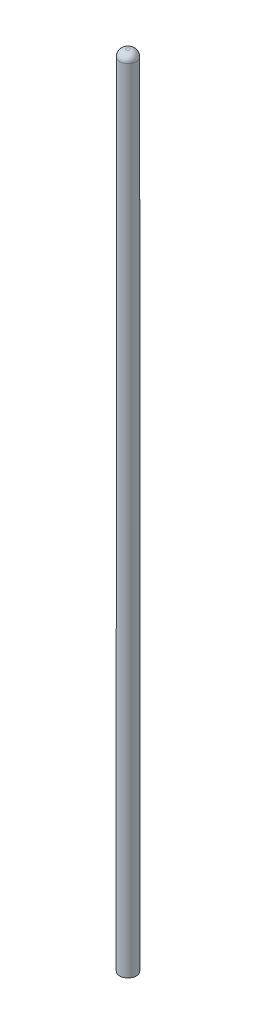
ISO-10303-21;
HEADER;
FILE_DESCRIPTION(('STEP AP214'),'2;1');
FILE_NAME('part.step','',(''),(''),'','','');
FILE_SCHEMA(('AUTOMOTIVE_DESIGN { 1 0 10303 214 1 1 1 1 }'));
ENDSEC;
DATA;
#1=APPLICATION_CONTEXT('core data for automotive mechanical design processes');
#2=APPLICATION_PROTOCOL_DEFINITION('international standard','automotive_design',2000,#1);
#3=PRODUCT_CONTEXT('',#1,'mechanical');
#4=PRODUCT('Part','Part','',(#3));
#5=PRODUCT_RELATED_PRODUCT_CATEGORY('part','',(#4));
#6=PRODUCT_DEFINITION_FORMATION('','',#4);
#7=PRODUCT_DEFINITION_CONTEXT('part definition',#1,'design');
#8=PRODUCT_DEFINITION('design','',#6,#7);
#9=PRODUCT_DEFINITION_SHAPE('','',#8);
#10=(LENGTH_UNIT() NAMED_UNIT(*) SI_UNIT(.MILLI.,.METRE.));
#11=(NAMED_UNIT(*) PLANE_ANGLE_UNIT() SI_UNIT($,.RADIAN.));
#12=(NAMED_UNIT(*) SI_UNIT($,.STERADIAN.) SOLID_ANGLE_UNIT());
#13=UNCERTAINTY_MEASURE_WITH_UNIT(LENGTH_MEASURE(1.E-05),#10,'distance_accuracy_value','');
#14=(GEOMETRIC_REPRESENTATION_CONTEXT(3) GLOBAL_UNCERTAINTY_ASSIGNED_CONTEXT((#13)) GLOBAL_UNIT_ASSIGNED_CONTEXT((#10,
#11,#12)) REPRESENTATION_CONTEXT('',''));
#15=CARTESIAN_POINT('',(0.,0.,0.));
#16=DIRECTION('',(0.,0.,1.));
#17=DIRECTION('',(1.,0.,0.));
#18=AXIS2_PLACEMENT_3D('',#15,#16,#17);
#19=CARTESIAN_POINT('',(0.,152.4,0.));
#20=DIRECTION('',(0.,-1.,0.));
#21=DIRECTION('',(0.,0.,-1.));
#22=AXIS2_PLACEMENT_3D('',#19,#20,#21);
#23=CYLINDRICAL_SURFACE('',#22,1.5875);
#24=CARTESIAN_POINT('',(0.,151.13,0.));
#25=DIRECTION('',(0.,1.,0.));
#26=DIRECTION('',(0.,0.,1.));
#27=AXIS2_PLACEMENT_3D('',#24,#25,#26);
#28=CIRCLE('',#27,1.5875);
#29=CARTESIAN_POINT('',(0.,151.13,-1.5875));
#30=VERTEX_POINT('',#29);
#31=EDGE_CURVE('E10',#30,#30,#28,.F.);
#32=CARTESIAN_POINT('',(0.,0.,0.));
#33=DIRECTION('',(0.,1.,0.));
#34=DIRECTION('',(0.,0.,1.));
#35=AXIS2_PLACEMENT_3D('',#32,#33,#34);
#36=CIRCLE('',#35,1.5875);
#37=CARTESIAN_POINT('',(0.,0.,-1.5875));
#38=VERTEX_POINT('',#37);
#39=EDGE_CURVE('E56',#38,#38,#36,.T.);
#40=CARTESIAN_POINT('',(0.,151.13,-1.5875));
#41=CARTESIAN_POINT('',(0.,149.555729166667,-1.5875));
#42=CARTESIAN_POINT('',(0.,147.981458333333,-1.5875));
#43=CARTESIAN_POINT('',(0.,144.832916666667,-1.5875));
#44=CARTESIAN_POINT('',(0.,143.258645833333,-1.5875));
#45=CARTESIAN_POINT('',(0.,140.110104166667,-1.5875));
#46=CARTESIAN_POINT('',(0.,138.535833333333,-1.5875));
#47=CARTESIAN_POINT('',(0.,135.387291666667,-1.5875));
#48=CARTESIAN_POINT('',(0.,133.813020833333,-1.5875));
#49=CARTESIAN_POINT('',(0.,130.664479166667,-1.5875));
#50=CARTESIAN_POINT('',(0.,129.090208333333,-1.5875));
#51=CARTESIAN_POINT('',(0.,125.941666666667,-1.5875));
#52=CARTESIAN_POINT('',(0.,124.367395833333,-1.5875));
#53=CARTESIAN_POINT('',(0.,121.218854166667,-1.5875));
#54=CARTESIAN_POINT('',(0.,119.644583333333,-1.5875));
#55=CARTESIAN_POINT('',(0.,116.496041666667,-1.5875));
#56=CARTESIAN_POINT('',(0.,114.921770833333,-1.5875));
#57=CARTESIAN_POINT('',(0.,111.773229166667,-1.5875));
#58=CARTESIAN_POINT('',(0.,110.198958333333,-1.5875));
#59=CARTESIAN_POINT('',(0.,107.050416666667,-1.5875));
#60=CARTESIAN_POINT('',(0.,105.476145833333,-1.5875));
#61=CARTESIAN_POINT('',(0.,102.327604166667,-1.5875));
#62=CARTESIAN_POINT('',(0.,100.753333333333,-1.5875));
#63=CARTESIAN_POINT('',(0.,97.6047916666667,-1.5875));
#64=CARTESIAN_POINT('',(0.,96.0305208333333,-1.5875));
#65=CARTESIAN_POINT('',(0.,92.8819791666667,-1.5875));
#66=CARTESIAN_POINT('',(0.,91.3077083333333,-1.5875));
#67=CARTESIAN_POINT('',(0.,88.1591666666667,-1.5875));
#68=CARTESIAN_POINT('',(0.,86.5848958333333,-1.5875));
#69=CARTESIAN_POINT('',(0.,83.4363541666667,-1.5875));
#70=CARTESIAN_POINT('',(0.,81.8620833333333,-1.5875));
#71=CARTESIAN_POINT('',(0.,78.7135416666667,-1.5875));
#72=CARTESIAN_POINT('',(0.,77.1392708333333,-1.5875));
#73=CARTESIAN_POINT('',(0.,73.9907291666667,-1.5875));
#74=CARTESIAN_POINT('',(0.,72.4164583333333,-1.5875));
#75=CARTESIAN_POINT('',(0.,69.2679166666667,-1.5875));
#76=CARTESIAN_POINT('',(0.,67.6936458333333,-1.5875));
#77=CARTESIAN_POINT('',(0.,64.5451041666667,-1.5875));
#78=CARTESIAN_POINT('',(0.,62.9708333333333,-1.5875));
#79=CARTESIAN_POINT('',(0.,59.8222916666667,-1.5875));
#80=CARTESIAN_POINT('',(0.,58.2480208333333,-1.5875));
#81=CARTESIAN_POINT('',(0.,55.0994791666667,-1.5875));
#82=CARTESIAN_POINT('',(0.,53.5252083333333,-1.5875));
#83=CARTESIAN_POINT('',(0.,50.3766666666667,-1.5875));
#84=CARTESIAN_POINT('',(0.,48.8023958333333,-1.5875));
#85=CARTESIAN_POINT('',(0.,45.6538541666667,-1.5875));
#86=CARTESIAN_POINT('',(0.,44.0795833333333,-1.5875));
#87=CARTESIAN_POINT('',(0.,40.9310416666667,-1.5875));
#88=CARTESIAN_POINT('',(0.,39.3567708333333,-1.5875));
#89=CARTESIAN_POINT('',(0.,36.2082291666666,-1.5875));
#90=CARTESIAN_POINT('',(0.,34.6339583333333,-1.5875));
#91=CARTESIAN_POINT('',(0.,31.4854166666666,-1.5875));
#92=CARTESIAN_POINT('',(0.,29.9111458333333,-1.5875));
#93=CARTESIAN_POINT('',(0.,26.7626041666666,-1.5875));
#94=CARTESIAN_POINT('',(0.,25.1883333333333,-1.5875));
#95=CARTESIAN_POINT('',(0.,22.0397916666666,-1.5875));
#96=CARTESIAN_POINT('',(0.,20.4655208333333,-1.5875));
#97=CARTESIAN_POINT('',(0.,17.3169791666666,-1.5875));
#98=CARTESIAN_POINT('',(0.,15.7427083333333,-1.5875));
#99=CARTESIAN_POINT('',(0.,12.5941666666666,-1.5875));
#100=CARTESIAN_POINT('',(0.,11.0198958333333,-1.5875));
#101=CARTESIAN_POINT('',(0.,7.87135416666668,-1.5875));
#102=CARTESIAN_POINT('',(0.,6.29708333333334,-1.5875));
#103=CARTESIAN_POINT('',(0.,3.14854166666667,-1.5875));
#104=CARTESIAN_POINT('',(0.,1.57427083333334,-1.5875));
#105=CARTESIAN_POINT('',(0.,0.,-1.5875));
#106=B_SPLINE_CURVE_WITH_KNOTS('',3,(#40,#41,#42,#43,#44,#45,#46,#47,#48,#49,#50,#51,#52,#53,
#54,#55,#56,#57,#58,#59,#60,#61,#62,#63,#64,#65,#66,#67,#68,#69,#70,#71,#72,#73,#74,#75,#76,#77,
#78,#79,#80,#81,#82,#83,#84,#85,#86,#87,#88,#89,#90,#91,#92,#93,#94,#95,#96,#97,#98,#99,#100,
#101,#102,#103,#104,#105),.UNSPECIFIED.,.F.,.F.,(4,2,2,2,2,2,2,2,2,2,2,2,2,2,2,2,2,2,2,2,2,2,2,
2,2,2,2,2,2,2,2,2,4),(0.,4.72281250000001,9.44562500000001,14.1684375,18.89125,23.6140625,
28.336875,33.0596875,37.7825,42.5053125,47.228125,51.9509375,56.67375,61.3965625,66.119375,
70.8421875,75.565,80.2878125,85.010625,89.7334375,94.45625,99.1790625,103.901875,108.6246875,
113.3475,118.0703125,122.793125,127.5159375,132.23875,136.9615625,141.684375,146.4071875,
151.13),.UNSPECIFIED.);
#107=EDGE_CURVE('BSEAM43',#30,#38,#106,.T.);
#108=ORIENTED_EDGE('',*,*,#31,.T.);
#109=ORIENTED_EDGE('',*,*,#39,.T.);
#110=ORIENTED_EDGE('',*,*,#107,.T.);
#111=ORIENTED_EDGE('',*,*,#107,.F.);
#112=EDGE_LOOP('',(#108,#110,#109,#111));
#113=FACE_BOUND('',#112,.T.);
#114=ADVANCED_FACE('F43',(#113),#23,.T.);
#115=CARTESIAN_POINT('',(0.,152.4,0.));
#116=DIRECTION('',(0.,1.,0.));
#117=DIRECTION('',(0.,0.,1.));
#118=AXIS2_PLACEMENT_3D('',#115,#116,#117);
#119=PLANE('',#118);
#120=CARTESIAN_POINT('',(0.,152.4,0.));
#121=DIRECTION('',(0.,1.,0.));
#122=DIRECTION('',(0.,0.,1.));
#123=AXIS2_PLACEMENT_3D('',#120,#121,#122);
#124=CIRCLE('',#123,0.3175);
#125=CARTESIAN_POINT('',(0.,152.4,0.3175));
#126=VERTEX_POINT('',#125);
#127=EDGE_CURVE('E51',#126,#126,#124,.T.);
#128=ORIENTED_EDGE('',*,*,#127,.T.);
#129=EDGE_LOOP('',(#128));
#130=FACE_BOUND('',#129,.T.);
#131=ADVANCED_FACE('F67',(#130),#119,.T.);
#132=CARTESIAN_POINT('',(0.,0.,0.));
#133=DIRECTION('',(0.,1.,0.));
#134=DIRECTION('',(0.,0.,1.));
#135=AXIS2_PLACEMENT_3D('',#132,#133,#134);
#136=PLANE('',#135);
#137=ORIENTED_EDGE('',*,*,#39,.F.);
#138=EDGE_LOOP('',(#137));
#139=FACE_BOUND('',#138,.T.);
#140=ADVANCED_FACE('F65',(#139),#136,.F.);
#141=CARTESIAN_POINT('',(0.,151.13,0.));
#142=DIRECTION('',(0.,1.,0.));
#143=DIRECTION('',(0.,0.,1.));
#144=AXIS2_PLACEMENT_3D('',#141,#142,#143);
#145=DEGENERATE_TOROIDAL_SURFACE('',#144,0.3175,1.27,.T.);
#146=ORIENTED_EDGE('',*,*,#31,.F.);
#147=EDGE_LOOP('',(#146));
#148=FACE_BOUND('',#147,.T.);
#149=ORIENTED_EDGE('',*,*,#127,.F.);
#150=EDGE_LOOP('',(#149));
#151=FACE_BOUND('',#150,.T.);
#152=ADVANCED_FACE('F45',(#148,#151),#145,.T.);
#153=CLOSED_SHELL('',(#114,#131,#140,#152));
#154=MANIFOLD_SOLID_BREP('B2',#153);
#155=ADVANCED_BREP_SHAPE_REPRESENTATION('',(#18,#154),#14);
#156=SHAPE_DEFINITION_REPRESENTATION(#9,#155);
ENDSEC;
END-ISO-10303-21;
